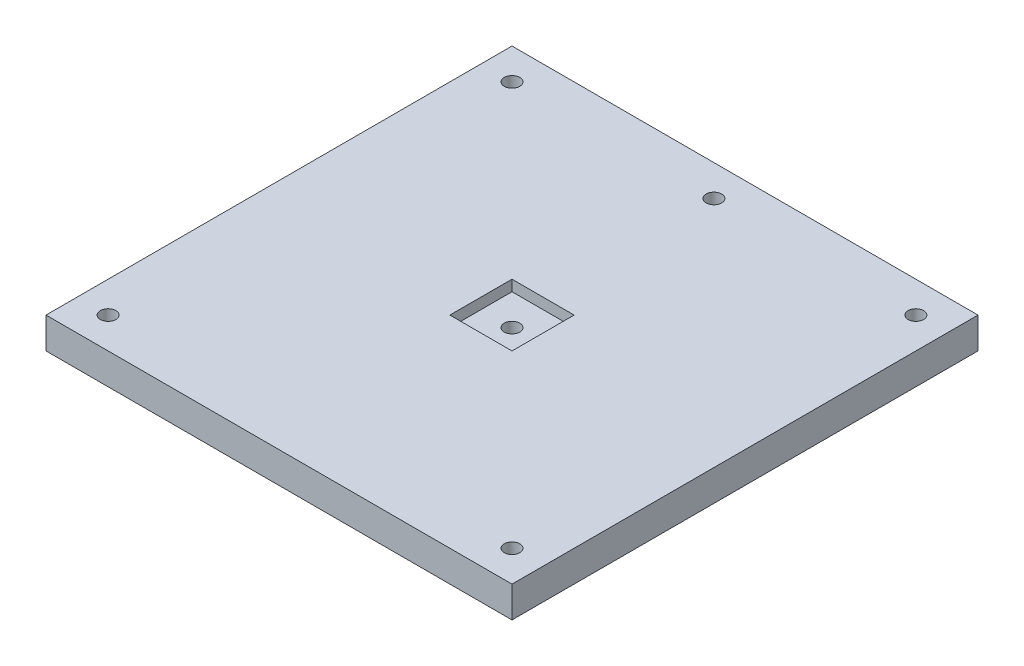
ISO-10303-21;
HEADER;
FILE_DESCRIPTION(('STEP AP214'),'2;1');
FILE_NAME('part.step','',(''),(''),'','','');
FILE_SCHEMA(('AUTOMOTIVE_DESIGN { 1 0 10303 214 1 1 1 1 }'));
ENDSEC;
DATA;
#1=APPLICATION_CONTEXT('core data for automotive mechanical design processes');
#2=APPLICATION_PROTOCOL_DEFINITION('international standard','automotive_design',2000,#1);
#3=PRODUCT_CONTEXT('',#1,'mechanical');
#4=PRODUCT('Part','Part','',(#3));
#5=PRODUCT_RELATED_PRODUCT_CATEGORY('part','',(#4));
#6=PRODUCT_DEFINITION_FORMATION('','',#4);
#7=PRODUCT_DEFINITION_CONTEXT('part definition',#1,'design');
#8=PRODUCT_DEFINITION('design','',#6,#7);
#9=PRODUCT_DEFINITION_SHAPE('','',#8);
#10=(LENGTH_UNIT() NAMED_UNIT(*) SI_UNIT(.MILLI.,.METRE.));
#11=(NAMED_UNIT(*) PLANE_ANGLE_UNIT() SI_UNIT($,.RADIAN.));
#12=(NAMED_UNIT(*) SI_UNIT($,.STERADIAN.) SOLID_ANGLE_UNIT());
#13=UNCERTAINTY_MEASURE_WITH_UNIT(LENGTH_MEASURE(1.E-05),#10,'distance_accuracy_value','');
#14=(GEOMETRIC_REPRESENTATION_CONTEXT(3) GLOBAL_UNCERTAINTY_ASSIGNED_CONTEXT((#13)) GLOBAL_UNIT_ASSIGNED_CONTEXT((#10,
#11,#12)) REPRESENTATION_CONTEXT('',''));
#15=CARTESIAN_POINT('',(0.,0.,0.));
#16=DIRECTION('',(0.,0.,1.));
#17=DIRECTION('',(1.,0.,0.));
#18=AXIS2_PLACEMENT_3D('',#15,#16,#17);
#19=CARTESIAN_POINT('',(0.,20.,0.));
#20=DIRECTION('',(0.,-1.,0.));
#21=DIRECTION('',(0.,0.,-1.));
#22=AXIS2_PLACEMENT_3D('',#19,#20,#21);
#23=PLANE('',#22);
#24=DIRECTION('',(-1.,0.,0.));
#25=VECTOR('',#24,1.);
#26=CARTESIAN_POINT('',(104.594594594595,20.,116.351351351351));
#27=LINE('',#26,#25);
#28=CARTESIAN_POINT('',(144.594594594595,20.,116.351351351351));
#29=VERTEX_POINT('',#28);
#30=CARTESIAN_POINT('',(104.594594594595,20.,116.351351351351));
#31=VERTEX_POINT('',#30);
#32=EDGE_CURVE('E139',#29,#31,#27,.T.);
#33=ORIENTED_EDGE('',*,*,#32,.F.);
#34=DIRECTION('',(0.,0.,-1.));
#35=VECTOR('',#34,1.);
#36=CARTESIAN_POINT('',(144.594594594595,20.,156.351351351351));
#37=LINE('',#36,#35);
#38=CARTESIAN_POINT('',(144.594594594595,20.,156.351351351351));
#39=VERTEX_POINT('',#38);
#40=EDGE_CURVE('E48',#39,#29,#37,.T.);
#41=ORIENTED_EDGE('',*,*,#40,.F.);
#42=DIRECTION('',(1.,0.,0.));
#43=VECTOR('',#42,1.);
#44=CARTESIAN_POINT('',(104.594594594595,20.,156.351351351351));
#45=LINE('',#44,#43);
#46=CARTESIAN_POINT('',(104.594594594595,20.,156.351351351351));
#47=VERTEX_POINT('',#46);
#48=EDGE_CURVE('E127',#47,#39,#45,.T.);
#49=ORIENTED_EDGE('',*,*,#48,.F.);
#50=DIRECTION('',(0.,0.,1.));
#51=VECTOR('',#50,1.);
#52=CARTESIAN_POINT('',(104.594594594595,20.,156.351351351351));
#53=LINE('',#52,#51);
#54=EDGE_CURVE('E130',#31,#47,#53,.T.);
#55=ORIENTED_EDGE('',*,*,#54,.F.);
#56=EDGE_LOOP('',(#33,#41,#49,#55));
#57=FACE_BOUND('',#56,.T.);
#58=DIRECTION('',(0.,0.,1.));
#59=VECTOR('',#58,1.);
#60=CARTESIAN_POINT('',(-25.4054054054054,20.,286.351351351351));
#61=LINE('',#60,#59);
#62=CARTESIAN_POINT('',(-25.4054054054054,20.,-13.6486486486487));
#63=VERTEX_POINT('',#62);
#64=CARTESIAN_POINT('',(-25.4054054054054,20.,286.351351351351));
#65=VERTEX_POINT('',#64);
#66=EDGE_CURVE('E180',#63,#65,#61,.T.);
#67=ORIENTED_EDGE('',*,*,#66,.T.);
#68=DIRECTION('',(1.,0.,0.));
#69=VECTOR('',#68,1.);
#70=CARTESIAN_POINT('',(-25.4054054054054,20.,286.351351351351));
#71=LINE('',#70,#69);
#72=CARTESIAN_POINT('',(274.594594594595,20.,286.351351351351));
#73=VERTEX_POINT('',#72);
#74=EDGE_CURVE('E85',#65,#73,#71,.T.);
#75=ORIENTED_EDGE('',*,*,#74,.T.);
#76=DIRECTION('',(0.,0.,-1.));
#77=VECTOR('',#76,1.);
#78=CARTESIAN_POINT('',(274.594594594595,20.,286.351351351351));
#79=LINE('',#78,#77);
#80=CARTESIAN_POINT('',(274.594594594595,20.,-13.6486486486487));
#81=VERTEX_POINT('',#80);
#82=EDGE_CURVE('E183',#73,#81,#79,.T.);
#83=ORIENTED_EDGE('',*,*,#82,.T.);
#84=DIRECTION('',(-1.,0.,0.));
#85=VECTOR('',#84,1.);
#86=CARTESIAN_POINT('',(-25.4054054054054,20.,-13.6486486486487));
#87=LINE('',#86,#85);
#88=EDGE_CURVE('E57',#81,#63,#87,.T.);
#89=ORIENTED_EDGE('',*,*,#88,.T.);
#90=EDGE_LOOP('',(#67,#75,#83,#89));
#91=FACE_BOUND('',#90,.T.);
#92=CARTESIAN_POINT('',(-5.40540540540542,20.,6.35135135135135));
#93=DIRECTION('',(0.,1.,0.));
#94=DIRECTION('',(0.,0.,1.));
#95=AXIS2_PLACEMENT_3D('',#92,#93,#94);
#96=CIRCLE('',#95,5.);
#97=CARTESIAN_POINT('',(-5.40540540540542,20.,11.3513513513513));
#98=VERTEX_POINT('',#97);
#99=EDGE_CURVE('E174',#98,#98,#96,.T.);
#100=ORIENTED_EDGE('',*,*,#99,.F.);
#101=EDGE_LOOP('',(#100));
#102=FACE_BOUND('',#101,.T.);
#103=CARTESIAN_POINT('',(254.594594594595,20.,6.35135135135135));
#104=DIRECTION('',(0.,1.,0.));
#105=DIRECTION('',(0.,0.,-1.));
#106=AXIS2_PLACEMENT_3D('',#103,#104,#105);
#107=CIRCLE('',#106,5.00000000000004);
#108=CARTESIAN_POINT('',(254.594594594595,20.,1.3513513513513));
#109=VERTEX_POINT('',#108);
#110=EDGE_CURVE('E168',#109,#109,#107,.T.);
#111=ORIENTED_EDGE('',*,*,#110,.F.);
#112=EDGE_LOOP('',(#111));
#113=FACE_BOUND('',#112,.T.);
#114=CARTESIAN_POINT('',(254.594594594595,20.,266.351351351351));
#115=DIRECTION('',(0.,1.,0.));
#116=DIRECTION('',(0.,0.,1.));
#117=AXIS2_PLACEMENT_3D('',#114,#115,#116);
#118=CIRCLE('',#117,5.00000000000005);
#119=CARTESIAN_POINT('',(254.594594594595,20.,271.351351351351));
#120=VERTEX_POINT('',#119);
#121=EDGE_CURVE('E162',#120,#120,#118,.T.);
#122=ORIENTED_EDGE('',*,*,#121,.F.);
#123=EDGE_LOOP('',(#122));
#124=FACE_BOUND('',#123,.T.);
#125=CARTESIAN_POINT('',(-5.40540540540542,20.,266.351351351351));
#126=DIRECTION('',(0.,1.,0.));
#127=DIRECTION('',(0.,0.,-1.));
#128=AXIS2_PLACEMENT_3D('',#125,#126,#127);
#129=CIRCLE('',#128,5.);
#130=CARTESIAN_POINT('',(-5.40540540540542,20.,261.351351351351));
#131=VERTEX_POINT('',#130);
#132=EDGE_CURVE('E156',#131,#131,#129,.T.);
#133=ORIENTED_EDGE('',*,*,#132,.F.);
#134=EDGE_LOOP('',(#133));
#135=FACE_BOUND('',#134,.T.);
#136=CARTESIAN_POINT('',(124.594594594595,20.,6.35135135135132));
#137=DIRECTION('',(0.,1.,0.));
#138=DIRECTION('',(0.,0.,-1.));
#139=AXIS2_PLACEMENT_3D('',#136,#137,#138);
#140=CIRCLE('',#139,5.00000000000002);
#141=CARTESIAN_POINT('',(124.594594594595,20.,1.3513513513513));
#142=VERTEX_POINT('',#141);
#143=EDGE_CURVE('E150',#142,#142,#140,.T.);
#144=ORIENTED_EDGE('',*,*,#143,.F.);
#145=EDGE_LOOP('',(#144));
#146=FACE_BOUND('',#145,.T.);
#147=ADVANCED_FACE('F33',(#57,#91,#102,#113,#124,#135,#146),#23,.F.);
#148=CARTESIAN_POINT('',(0.,0.,0.));
#149=DIRECTION('',(0.,-1.,0.));
#150=DIRECTION('',(0.,0.,-1.));
#151=AXIS2_PLACEMENT_3D('',#148,#149,#150);
#152=PLANE('',#151);
#153=CARTESIAN_POINT('',(124.594594594595,0.,136.351351351351));
#154=DIRECTION('',(0.,1.,0.));
#155=DIRECTION('',(0.,0.,1.));
#156=AXIS2_PLACEMENT_3D('',#153,#154,#155);
#157=CIRCLE('',#156,4.99999999999999);
#158=CARTESIAN_POINT('',(124.594594594595,0.,141.351351351351));
#159=VERTEX_POINT('',#158);
#160=EDGE_CURVE('E140',#159,#159,#157,.T.);
#161=ORIENTED_EDGE('',*,*,#160,.T.);
#162=EDGE_LOOP('',(#161));
#163=FACE_BOUND('',#162,.T.);
#164=CARTESIAN_POINT('',(-5.40540540540542,0.,266.351351351351));
#165=DIRECTION('',(0.,1.,0.));
#166=DIRECTION('',(0.,0.,-1.));
#167=AXIS2_PLACEMENT_3D('',#164,#165,#166);
#168=CIRCLE('',#167,5.);
#169=CARTESIAN_POINT('',(-5.40540540540542,0.,261.351351351351));
#170=VERTEX_POINT('',#169);
#171=EDGE_CURVE('E153',#170,#170,#168,.T.);
#172=ORIENTED_EDGE('',*,*,#171,.T.);
#173=EDGE_LOOP('',(#172));
#174=FACE_BOUND('',#173,.T.);
#175=CARTESIAN_POINT('',(254.594594594595,0.,6.35135135135135));
#176=DIRECTION('',(0.,1.,0.));
#177=DIRECTION('',(0.,0.,-1.));
#178=AXIS2_PLACEMENT_3D('',#175,#176,#177);
#179=CIRCLE('',#178,5.00000000000004);
#180=CARTESIAN_POINT('',(254.594594594595,0.,1.3513513513513));
#181=VERTEX_POINT('',#180);
#182=EDGE_CURVE('E165',#181,#181,#179,.T.);
#183=ORIENTED_EDGE('',*,*,#182,.T.);
#184=EDGE_LOOP('',(#183));
#185=FACE_BOUND('',#184,.T.);
#186=DIRECTION('',(0.,0.,1.));
#187=VECTOR('',#186,1.);
#188=CARTESIAN_POINT('',(-25.4054054054054,0.,286.351351351351));
#189=LINE('',#188,#187);
#190=CARTESIAN_POINT('',(-25.4054054054054,0.,-13.6486486486487));
#191=VERTEX_POINT('',#190);
#192=CARTESIAN_POINT('',(-25.4054054054054,0.,286.351351351351));
#193=VERTEX_POINT('',#192);
#194=EDGE_CURVE('E177',#191,#193,#189,.T.);
#195=ORIENTED_EDGE('',*,*,#194,.F.);
#196=DIRECTION('',(-1.,0.,0.));
#197=VECTOR('',#196,1.);
#198=CARTESIAN_POINT('',(-25.4054054054054,0.,-13.6486486486487));
#199=LINE('',#198,#197);
#200=CARTESIAN_POINT('',(274.594594594595,0.,-13.6486486486487));
#201=VERTEX_POINT('',#200);
#202=EDGE_CURVE('E78',#201,#191,#199,.T.);
#203=ORIENTED_EDGE('',*,*,#202,.F.);
#204=DIRECTION('',(0.,0.,-1.));
#205=VECTOR('',#204,1.);
#206=CARTESIAN_POINT('',(274.594594594595,0.,286.351351351351));
#207=LINE('',#206,#205);
#208=CARTESIAN_POINT('',(274.594594594595,0.,286.351351351351));
#209=VERTEX_POINT('',#208);
#210=EDGE_CURVE('E191',#209,#201,#207,.T.);
#211=ORIENTED_EDGE('',*,*,#210,.F.);
#212=DIRECTION('',(1.,0.,0.));
#213=VECTOR('',#212,1.);
#214=CARTESIAN_POINT('',(-25.4054054054054,0.,286.351351351351));
#215=LINE('',#214,#213);
#216=EDGE_CURVE('E189',#193,#209,#215,.T.);
#217=ORIENTED_EDGE('',*,*,#216,.F.);
#218=EDGE_LOOP('',(#195,#203,#211,#217));
#219=FACE_BOUND('',#218,.T.);
#220=CARTESIAN_POINT('',(-5.40540540540542,0.,6.35135135135135));
#221=DIRECTION('',(0.,1.,0.));
#222=DIRECTION('',(0.,0.,1.));
#223=AXIS2_PLACEMENT_3D('',#220,#221,#222);
#224=CIRCLE('',#223,5.);
#225=CARTESIAN_POINT('',(-5.40540540540542,0.,11.3513513513513));
#226=VERTEX_POINT('',#225);
#227=EDGE_CURVE('E171',#226,#226,#224,.T.);
#228=ORIENTED_EDGE('',*,*,#227,.T.);
#229=EDGE_LOOP('',(#228));
#230=FACE_BOUND('',#229,.T.);
#231=CARTESIAN_POINT('',(254.594594594595,0.,266.351351351351));
#232=DIRECTION('',(0.,1.,0.));
#233=DIRECTION('',(0.,0.,1.));
#234=AXIS2_PLACEMENT_3D('',#231,#232,#233);
#235=CIRCLE('',#234,5.00000000000005);
#236=CARTESIAN_POINT('',(254.594594594595,0.,271.351351351351));
#237=VERTEX_POINT('',#236);
#238=EDGE_CURVE('E159',#237,#237,#235,.T.);
#239=ORIENTED_EDGE('',*,*,#238,.T.);
#240=EDGE_LOOP('',(#239));
#241=FACE_BOUND('',#240,.T.);
#242=CARTESIAN_POINT('',(124.594594594595,0.,6.35135135135132));
#243=DIRECTION('',(0.,1.,0.));
#244=DIRECTION('',(0.,0.,-1.));
#245=AXIS2_PLACEMENT_3D('',#242,#243,#244);
#246=CIRCLE('',#245,5.00000000000002);
#247=CARTESIAN_POINT('',(124.594594594595,0.,1.3513513513513));
#248=VERTEX_POINT('',#247);
#249=EDGE_CURVE('E146',#248,#248,#246,.T.);
#250=ORIENTED_EDGE('',*,*,#249,.T.);
#251=EDGE_LOOP('',(#250));
#252=FACE_BOUND('',#251,.T.);
#253=ADVANCED_FACE('F204',(#163,#174,#185,#219,#230,#241,#252),#152,.T.);
#254=CARTESIAN_POINT('',(-25.4054054054054,20.,286.351351351351));
#255=DIRECTION('',(1.,0.,0.));
#256=DIRECTION('',(0.,0.,-1.));
#257=AXIS2_PLACEMENT_3D('',#254,#255,#256);
#258=PLANE('',#257);
#259=ORIENTED_EDGE('',*,*,#194,.T.);
#260=DIRECTION('',(0.,-1.,0.));
#261=VECTOR('',#260,1.);
#262=CARTESIAN_POINT('',(-25.4054054054054,20.,286.351351351351));
#263=LINE('',#262,#261);
#264=EDGE_CURVE('E11',#65,#193,#263,.T.);
#265=ORIENTED_EDGE('',*,*,#264,.F.);
#266=ORIENTED_EDGE('',*,*,#66,.F.);
#267=DIRECTION('',(0.,-1.,0.));
#268=VECTOR('',#267,1.);
#269=CARTESIAN_POINT('',(-25.4054054054054,20.,-13.6486486486487));
#270=LINE('',#269,#268);
#271=EDGE_CURVE('E186',#63,#191,#270,.T.);
#272=ORIENTED_EDGE('',*,*,#271,.T.);
#273=EDGE_LOOP('',(#259,#265,#266,#272));
#274=FACE_BOUND('',#273,.T.);
#275=ADVANCED_FACE('F35',(#274),#258,.F.);
#276=CARTESIAN_POINT('',(-25.4054054054054,20.,286.351351351351));
#277=DIRECTION('',(0.,0.,-1.));
#278=DIRECTION('',(-1.,0.,0.));
#279=AXIS2_PLACEMENT_3D('',#276,#277,#278);
#280=PLANE('',#279);
#281=ORIENTED_EDGE('',*,*,#216,.T.);
#282=DIRECTION('',(0.,-1.,0.));
#283=VECTOR('',#282,1.);
#284=CARTESIAN_POINT('',(274.594594594595,20.,286.351351351351));
#285=LINE('',#284,#283);
#286=EDGE_CURVE('E41',#73,#209,#285,.T.);
#287=ORIENTED_EDGE('',*,*,#286,.F.);
#288=ORIENTED_EDGE('',*,*,#74,.F.);
#289=ORIENTED_EDGE('',*,*,#264,.T.);
#290=EDGE_LOOP('',(#281,#287,#288,#289));
#291=FACE_BOUND('',#290,.T.);
#292=ADVANCED_FACE('F220',(#291),#280,.F.);
#293=CARTESIAN_POINT('',(274.594594594595,20.,286.351351351351));
#294=DIRECTION('',(-1.,0.,0.));
#295=DIRECTION('',(0.,0.,1.));
#296=AXIS2_PLACEMENT_3D('',#293,#294,#295);
#297=PLANE('',#296);
#298=ORIENTED_EDGE('',*,*,#210,.T.);
#299=DIRECTION('',(0.,-1.,0.));
#300=VECTOR('',#299,1.);
#301=CARTESIAN_POINT('',(274.594594594595,20.,-13.6486486486487));
#302=LINE('',#301,#300);
#303=EDGE_CURVE('E195',#81,#201,#302,.T.);
#304=ORIENTED_EDGE('',*,*,#303,.F.);
#305=ORIENTED_EDGE('',*,*,#82,.F.);
#306=ORIENTED_EDGE('',*,*,#286,.T.);
#307=EDGE_LOOP('',(#298,#304,#305,#306));
#308=FACE_BOUND('',#307,.T.);
#309=ADVANCED_FACE('F200',(#308),#297,.F.);
#310=CARTESIAN_POINT('',(-25.4054054054054,20.,-13.6486486486487));
#311=DIRECTION('',(0.,0.,1.));
#312=DIRECTION('',(1.,0.,0.));
#313=AXIS2_PLACEMENT_3D('',#310,#311,#312);
#314=PLANE('',#313);
#315=ORIENTED_EDGE('',*,*,#202,.T.);
#316=ORIENTED_EDGE('',*,*,#271,.F.);
#317=ORIENTED_EDGE('',*,*,#88,.F.);
#318=ORIENTED_EDGE('',*,*,#303,.T.);
#319=EDGE_LOOP('',(#315,#316,#317,#318));
#320=FACE_BOUND('',#319,.T.);
#321=ADVANCED_FACE('F209',(#320),#314,.F.);
#322=CARTESIAN_POINT('',(-5.40540540540542,20.,6.35135135135135));
#323=DIRECTION('',(0.,-1.,0.));
#324=DIRECTION('',(0.,0.,-1.));
#325=AXIS2_PLACEMENT_3D('',#322,#323,#324);
#326=CYLINDRICAL_SURFACE('',#325,5.);
#327=ORIENTED_EDGE('',*,*,#99,.T.);
#328=EDGE_LOOP('',(#327));
#329=FACE_BOUND('',#328,.T.);
#330=ORIENTED_EDGE('',*,*,#227,.F.);
#331=EDGE_LOOP('',(#330));
#332=FACE_BOUND('',#331,.T.);
#333=ADVANCED_FACE('F211',(#329,#332),#326,.F.);
#334=CARTESIAN_POINT('',(254.594594594595,20.,6.35135135135135));
#335=DIRECTION('',(0.,-1.,0.));
#336=DIRECTION('',(0.,0.,-1.));
#337=AXIS2_PLACEMENT_3D('',#334,#335,#336);
#338=CYLINDRICAL_SURFACE('',#337,5.00000000000004);
#339=ORIENTED_EDGE('',*,*,#110,.T.);
#340=EDGE_LOOP('',(#339));
#341=FACE_BOUND('',#340,.T.);
#342=ORIENTED_EDGE('',*,*,#182,.F.);
#343=EDGE_LOOP('',(#342));
#344=FACE_BOUND('',#343,.T.);
#345=ADVANCED_FACE('F217',(#341,#344),#338,.F.);
#346=CARTESIAN_POINT('',(254.594594594595,20.,266.351351351351));
#347=DIRECTION('',(0.,-1.,0.));
#348=DIRECTION('',(0.,0.,-1.));
#349=AXIS2_PLACEMENT_3D('',#346,#347,#348);
#350=CYLINDRICAL_SURFACE('',#349,5.00000000000005);
#351=ORIENTED_EDGE('',*,*,#121,.T.);
#352=EDGE_LOOP('',(#351));
#353=FACE_BOUND('',#352,.T.);
#354=ORIENTED_EDGE('',*,*,#238,.F.);
#355=EDGE_LOOP('',(#354));
#356=FACE_BOUND('',#355,.T.);
#357=ADVANCED_FACE('F233',(#353,#356),#350,.F.);
#358=CARTESIAN_POINT('',(-5.40540540540542,20.,266.351351351351));
#359=DIRECTION('',(0.,-1.,0.));
#360=DIRECTION('',(0.,0.,-1.));
#361=AXIS2_PLACEMENT_3D('',#358,#359,#360);
#362=CYLINDRICAL_SURFACE('',#361,5.);
#363=ORIENTED_EDGE('',*,*,#132,.T.);
#364=EDGE_LOOP('',(#363));
#365=FACE_BOUND('',#364,.T.);
#366=ORIENTED_EDGE('',*,*,#171,.F.);
#367=EDGE_LOOP('',(#366));
#368=FACE_BOUND('',#367,.T.);
#369=ADVANCED_FACE('F237',(#365,#368),#362,.F.);
#370=CARTESIAN_POINT('',(124.594594594595,20.,6.35135135135132));
#371=DIRECTION('',(0.,-1.,0.));
#372=DIRECTION('',(0.,0.,-1.));
#373=AXIS2_PLACEMENT_3D('',#370,#371,#372);
#374=CYLINDRICAL_SURFACE('',#373,5.00000000000002);
#375=ORIENTED_EDGE('',*,*,#143,.T.);
#376=EDGE_LOOP('',(#375));
#377=FACE_BOUND('',#376,.T.);
#378=ORIENTED_EDGE('',*,*,#249,.F.);
#379=EDGE_LOOP('',(#378));
#380=FACE_BOUND('',#379,.T.);
#381=ADVANCED_FACE('F241',(#377,#380),#374,.F.);
#382=CARTESIAN_POINT('',(144.594594594595,13.,156.351351351351));
#383=DIRECTION('',(1.,0.,0.));
#384=DIRECTION('',(0.,0.,-1.));
#385=AXIS2_PLACEMENT_3D('',#382,#383,#384);
#386=PLANE('',#385);
#387=ORIENTED_EDGE('',*,*,#40,.T.);
#388=DIRECTION('',(0.,1.,0.));
#389=VECTOR('',#388,1.);
#390=CARTESIAN_POINT('',(144.594594594595,13.,116.351351351351));
#391=LINE('',#390,#389);
#392=CARTESIAN_POINT('',(144.594594594595,13.,116.351351351351));
#393=VERTEX_POINT('',#392);
#394=EDGE_CURVE('E105',#393,#29,#391,.T.);
#395=ORIENTED_EDGE('',*,*,#394,.F.);
#396=DIRECTION('',(0.,0.,-1.));
#397=VECTOR('',#396,1.);
#398=CARTESIAN_POINT('',(144.594594594595,13.,156.351351351351));
#399=LINE('',#398,#397);
#400=CARTESIAN_POINT('',(144.594594594595,13.,156.351351351351));
#401=VERTEX_POINT('',#400);
#402=EDGE_CURVE('E109',#401,#393,#399,.T.);
#403=ORIENTED_EDGE('',*,*,#402,.F.);
#404=DIRECTION('',(0.,1.,0.));
#405=VECTOR('',#404,1.);
#406=CARTESIAN_POINT('',(144.594594594595,13.,156.351351351351));
#407=LINE('',#406,#405);
#408=EDGE_CURVE('E144',#401,#39,#407,.T.);
#409=ORIENTED_EDGE('',*,*,#408,.T.);
#410=EDGE_LOOP('',(#387,#395,#403,#409));
#411=FACE_BOUND('',#410,.T.);
#412=ADVANCED_FACE('F107',(#411),#386,.F.);
#413=CARTESIAN_POINT('',(104.594594594595,13.,156.351351351351));
#414=DIRECTION('',(0.,0.,1.));
#415=DIRECTION('',(1.,0.,0.));
#416=AXIS2_PLACEMENT_3D('',#413,#414,#415);
#417=PLANE('',#416);
#418=ORIENTED_EDGE('',*,*,#48,.T.);
#419=ORIENTED_EDGE('',*,*,#408,.F.);
#420=DIRECTION('',(1.,0.,0.));
#421=VECTOR('',#420,1.);
#422=CARTESIAN_POINT('',(104.594594594595,13.,156.351351351351));
#423=LINE('',#422,#421);
#424=CARTESIAN_POINT('',(104.594594594595,13.,156.351351351351));
#425=VERTEX_POINT('',#424);
#426=EDGE_CURVE('E115',#425,#401,#423,.T.);
#427=ORIENTED_EDGE('',*,*,#426,.F.);
#428=DIRECTION('',(0.,1.,0.));
#429=VECTOR('',#428,1.);
#430=CARTESIAN_POINT('',(104.594594594595,13.,156.351351351351));
#431=LINE('',#430,#429);
#432=EDGE_CURVE('E147',#425,#47,#431,.T.);
#433=ORIENTED_EDGE('',*,*,#432,.T.);
#434=EDGE_LOOP('',(#418,#419,#427,#433));
#435=FACE_BOUND('',#434,.T.);
#436=ADVANCED_FACE('F248',(#435),#417,.F.);
#437=CARTESIAN_POINT('',(104.594594594595,13.,156.351351351351));
#438=DIRECTION('',(-1.,0.,0.));
#439=DIRECTION('',(0.,0.,1.));
#440=AXIS2_PLACEMENT_3D('',#437,#438,#439);
#441=PLANE('',#440);
#442=ORIENTED_EDGE('',*,*,#54,.T.);
#443=ORIENTED_EDGE('',*,*,#432,.F.);
#444=DIRECTION('',(0.,0.,1.));
#445=VECTOR('',#444,1.);
#446=CARTESIAN_POINT('',(104.594594594595,13.,156.351351351351));
#447=LINE('',#446,#445);
#448=CARTESIAN_POINT('',(104.594594594595,13.,116.351351351351));
#449=VERTEX_POINT('',#448);
#450=EDGE_CURVE('E123',#449,#425,#447,.T.);
#451=ORIENTED_EDGE('',*,*,#450,.F.);
#452=DIRECTION('',(0.,1.,0.));
#453=VECTOR('',#452,1.);
#454=CARTESIAN_POINT('',(104.594594594595,13.,116.351351351351));
#455=LINE('',#454,#453);
#456=EDGE_CURVE('E114',#449,#31,#455,.T.);
#457=ORIENTED_EDGE('',*,*,#456,.T.);
#458=EDGE_LOOP('',(#442,#443,#451,#457));
#459=FACE_BOUND('',#458,.T.);
#460=ADVANCED_FACE('F251',(#459),#441,.F.);
#461=CARTESIAN_POINT('',(104.594594594595,13.,116.351351351351));
#462=DIRECTION('',(0.,0.,-1.));
#463=DIRECTION('',(-1.,0.,0.));
#464=AXIS2_PLACEMENT_3D('',#461,#462,#463);
#465=PLANE('',#464);
#466=ORIENTED_EDGE('',*,*,#32,.T.);
#467=ORIENTED_EDGE('',*,*,#456,.F.);
#468=DIRECTION('',(-1.,0.,0.));
#469=VECTOR('',#468,1.);
#470=CARTESIAN_POINT('',(104.594594594595,13.,116.351351351351));
#471=LINE('',#470,#469);
#472=EDGE_CURVE('E118',#393,#449,#471,.T.);
#473=ORIENTED_EDGE('',*,*,#472,.F.);
#474=ORIENTED_EDGE('',*,*,#394,.T.);
#475=EDGE_LOOP('',(#466,#467,#473,#474));
#476=FACE_BOUND('',#475,.T.);
#477=ADVANCED_FACE('F119',(#476),#465,.F.);
#478=CARTESIAN_POINT('',(0.,13.,0.));
#479=DIRECTION('',(0.,-1.,0.));
#480=DIRECTION('',(0.,0.,-1.));
#481=AXIS2_PLACEMENT_3D('',#478,#479,#480);
#482=PLANE('',#481);
#483=CARTESIAN_POINT('',(124.594594594595,13.,136.351351351351));
#484=DIRECTION('',(0.,1.,0.));
#485=DIRECTION('',(0.,0.,1.));
#486=AXIS2_PLACEMENT_3D('',#483,#484,#485);
#487=CIRCLE('',#486,4.99999999999999);
#488=CARTESIAN_POINT('',(124.594594594595,13.,141.351351351351));
#489=VERTEX_POINT('',#488);
#490=EDGE_CURVE('E133',#489,#489,#487,.T.);
#491=ORIENTED_EDGE('',*,*,#490,.F.);
#492=EDGE_LOOP('',(#491));
#493=FACE_BOUND('',#492,.T.);
#494=ORIENTED_EDGE('',*,*,#402,.T.);
#495=ORIENTED_EDGE('',*,*,#472,.T.);
#496=ORIENTED_EDGE('',*,*,#450,.T.);
#497=ORIENTED_EDGE('',*,*,#426,.T.);
#498=EDGE_LOOP('',(#494,#495,#496,#497));
#499=FACE_BOUND('',#498,.T.);
#500=ADVANCED_FACE('F125',(#493,#499),#482,.F.);
#501=CARTESIAN_POINT('',(124.594594594595,0.,136.351351351351));
#502=DIRECTION('',(0.,1.,0.));
#503=DIRECTION('',(0.,0.,1.));
#504=AXIS2_PLACEMENT_3D('',#501,#502,#503);
#505=CYLINDRICAL_SURFACE('',#504,4.99999999999999);
#506=ORIENTED_EDGE('',*,*,#160,.F.);
#507=EDGE_LOOP('',(#506));
#508=FACE_BOUND('',#507,.T.);
#509=ORIENTED_EDGE('',*,*,#490,.T.);
#510=EDGE_LOOP('',(#509));
#511=FACE_BOUND('',#510,.T.);
#512=ADVANCED_FACE('F260',(#508,#511),#505,.F.);
#513=CLOSED_SHELL('',(#147,#253,#275,#292,#309,#321,#333,#345,#357,#369,#381,#412,#436,#460,
#477,#500,#512));
#514=MANIFOLD_SOLID_BREP('B2',#513);
#515=ADVANCED_BREP_SHAPE_REPRESENTATION('',(#18,#514),#14);
#516=SHAPE_DEFINITION_REPRESENTATION(#9,#515);
ENDSEC;
END-ISO-10303-21;
